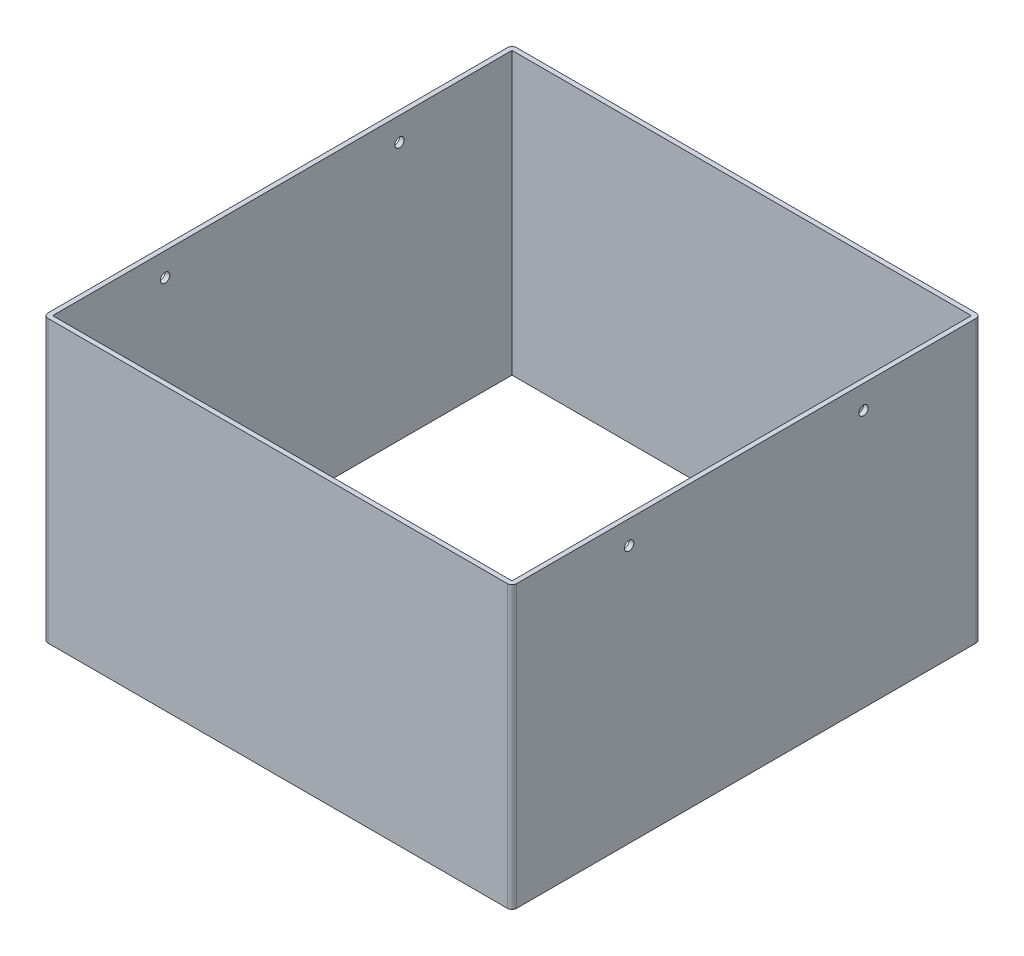
ISO-10303-21;
HEADER;
FILE_DESCRIPTION(('STEP AP214'),'2;1');
FILE_NAME('part.step','',(''),(''),'','','');
FILE_SCHEMA(('AUTOMOTIVE_DESIGN { 1 0 10303 214 1 1 1 1 }'));
ENDSEC;
DATA;
#1=APPLICATION_CONTEXT('core data for automotive mechanical design processes');
#2=APPLICATION_PROTOCOL_DEFINITION('international standard','automotive_design',2000,#1);
#3=PRODUCT_CONTEXT('',#1,'mechanical');
#4=PRODUCT('Part','Part','',(#3));
#5=PRODUCT_RELATED_PRODUCT_CATEGORY('part','',(#4));
#6=PRODUCT_DEFINITION_FORMATION('','',#4);
#7=PRODUCT_DEFINITION_CONTEXT('part definition',#1,'design');
#8=PRODUCT_DEFINITION('design','',#6,#7);
#9=PRODUCT_DEFINITION_SHAPE('','',#8);
#10=(LENGTH_UNIT() NAMED_UNIT(*) SI_UNIT(.MILLI.,.METRE.));
#11=(NAMED_UNIT(*) PLANE_ANGLE_UNIT() SI_UNIT($,.RADIAN.));
#12=(NAMED_UNIT(*) SI_UNIT($,.STERADIAN.) SOLID_ANGLE_UNIT());
#13=UNCERTAINTY_MEASURE_WITH_UNIT(LENGTH_MEASURE(1.E-05),#10,'distance_accuracy_value','');
#14=(GEOMETRIC_REPRESENTATION_CONTEXT(3) GLOBAL_UNCERTAINTY_ASSIGNED_CONTEXT((#13)) GLOBAL_UNIT_ASSIGNED_CONTEXT((#10,
#11,#12)) REPRESENTATION_CONTEXT('',''));
#15=CARTESIAN_POINT('',(0.,0.,0.));
#16=DIRECTION('',(0.,0.,1.));
#17=DIRECTION('',(1.,0.,0.));
#18=AXIS2_PLACEMENT_3D('',#15,#16,#17);
#19=CARTESIAN_POINT('',(50.,60.,-50.));
#20=DIRECTION('',(-1.,0.,0.));
#21=DIRECTION('',(0.,0.,1.));
#22=AXIS2_PLACEMENT_3D('',#19,#20,#21);
#23=PLANE('',#22);
#24=CARTESIAN_POINT('',(50.,55.,-25.));
#25=DIRECTION('',(-1.,0.,0.));
#26=DIRECTION('',(0.,0.,1.));
#27=AXIS2_PLACEMENT_3D('',#24,#25,#26);
#28=CIRCLE('',#27,1.);
#29=CARTESIAN_POINT('',(50.,55.,-24.));
#30=VERTEX_POINT('',#29);
#31=EDGE_CURVE('E235',#30,#30,#28,.T.);
#32=ORIENTED_EDGE('',*,*,#31,.T.);
#33=EDGE_LOOP('',(#32));
#34=FACE_BOUND('',#33,.T.);
#35=DIRECTION('',(0.,0.,-1.));
#36=VECTOR('',#35,1.);
#37=CARTESIAN_POINT('',(50.,60.,-50.));
#38=LINE('',#37,#36);
#39=CARTESIAN_POINT('',(50.,60.,49.));
#40=VERTEX_POINT('',#39);
#41=CARTESIAN_POINT('',(50.,60.,-49.));
#42=VERTEX_POINT('',#41);
#43=EDGE_CURVE('E182',#40,#42,#38,.T.);
#44=ORIENTED_EDGE('',*,*,#43,.F.);
#45=DIRECTION('',(0.,-1.,0.));
#46=VECTOR('',#45,1.);
#47=CARTESIAN_POINT('',(50.,60.,49.));
#48=LINE('',#47,#46);
#49=CARTESIAN_POINT('',(50.,0.,49.));
#50=VERTEX_POINT('',#49);
#51=EDGE_CURVE('E275',#40,#50,#48,.T.);
#52=ORIENTED_EDGE('',*,*,#51,.T.);
#53=DIRECTION('',(0.,0.,-1.));
#54=VECTOR('',#53,1.);
#55=CARTESIAN_POINT('',(50.,0.,-50.));
#56=LINE('',#55,#54);
#57=CARTESIAN_POINT('',(50.,0.,-49.));
#58=VERTEX_POINT('',#57);
#59=EDGE_CURVE('E177',#50,#58,#56,.T.);
#60=ORIENTED_EDGE('',*,*,#59,.T.);
#61=DIRECTION('',(0.,-1.,0.));
#62=VECTOR('',#61,1.);
#63=CARTESIAN_POINT('',(50.,60.,-49.));
#64=LINE('',#63,#62);
#65=EDGE_CURVE('E272',#58,#42,#64,.F.);
#66=ORIENTED_EDGE('',*,*,#65,.T.);
#67=EDGE_LOOP('',(#44,#52,#60,#66));
#68=FACE_BOUND('',#67,.T.);
#69=CARTESIAN_POINT('',(50.,55.,25.));
#70=DIRECTION('',(-1.,0.,0.));
#71=DIRECTION('',(0.,0.,1.));
#72=AXIS2_PLACEMENT_3D('',#69,#70,#71);
#73=CIRCLE('',#72,1.);
#74=CARTESIAN_POINT('',(50.,55.,26.));
#75=VERTEX_POINT('',#74);
#76=EDGE_CURVE('E389',#75,#75,#73,.F.);
#77=ORIENTED_EDGE('',*,*,#76,.F.);
#78=EDGE_LOOP('',(#77));
#79=FACE_BOUND('',#78,.T.);
#80=ADVANCED_FACE('F48',(#34,#68,#79),#23,.F.);
#81=CARTESIAN_POINT('',(-50.,60.,-50.));
#82=DIRECTION('',(1.,0.,0.));
#83=DIRECTION('',(0.,0.,-1.));
#84=AXIS2_PLACEMENT_3D('',#81,#82,#83);
#85=PLANE('',#84);
#86=CARTESIAN_POINT('',(-50.,55.,-25.));
#87=DIRECTION('',(-1.,0.,0.));
#88=DIRECTION('',(0.,0.,1.));
#89=AXIS2_PLACEMENT_3D('',#86,#87,#88);
#90=CIRCLE('',#89,1.);
#91=CARTESIAN_POINT('',(-50.,55.,-24.));
#92=VERTEX_POINT('',#91);
#93=EDGE_CURVE('E376',#92,#92,#90,.T.);
#94=ORIENTED_EDGE('',*,*,#93,.F.);
#95=EDGE_LOOP('',(#94));
#96=FACE_BOUND('',#95,.T.);
#97=DIRECTION('',(0.,0.,1.));
#98=VECTOR('',#97,1.);
#99=CARTESIAN_POINT('',(-50.,0.,-50.));
#100=LINE('',#99,#98);
#101=CARTESIAN_POINT('',(-50.,0.,-49.));
#102=VERTEX_POINT('',#101);
#103=CARTESIAN_POINT('',(-50.,0.,49.));
#104=VERTEX_POINT('',#103);
#105=EDGE_CURVE('E204',#102,#104,#100,.T.);
#106=ORIENTED_EDGE('',*,*,#105,.T.);
#107=DIRECTION('',(0.,-1.,0.));
#108=VECTOR('',#107,1.);
#109=CARTESIAN_POINT('',(-50.,60.,49.));
#110=LINE('',#109,#108);
#111=CARTESIAN_POINT('',(-50.,60.,49.));
#112=VERTEX_POINT('',#111);
#113=EDGE_CURVE('E258',#104,#112,#110,.F.);
#114=ORIENTED_EDGE('',*,*,#113,.T.);
#115=DIRECTION('',(0.,0.,1.));
#116=VECTOR('',#115,1.);
#117=CARTESIAN_POINT('',(-50.,60.,-50.));
#118=LINE('',#117,#116);
#119=CARTESIAN_POINT('',(-50.,60.,-49.));
#120=VERTEX_POINT('',#119);
#121=EDGE_CURVE('E189',#120,#112,#118,.T.);
#122=ORIENTED_EDGE('',*,*,#121,.F.);
#123=DIRECTION('',(0.,-1.,0.));
#124=VECTOR('',#123,1.);
#125=CARTESIAN_POINT('',(-50.,60.,-49.));
#126=LINE('',#125,#124);
#127=EDGE_CURVE('E254',#120,#102,#126,.T.);
#128=ORIENTED_EDGE('',*,*,#127,.T.);
#129=EDGE_LOOP('',(#106,#114,#122,#128));
#130=FACE_BOUND('',#129,.T.);
#131=CARTESIAN_POINT('',(-50.,55.,25.));
#132=DIRECTION('',(-1.,0.,0.));
#133=DIRECTION('',(0.,0.,1.));
#134=AXIS2_PLACEMENT_3D('',#131,#132,#133);
#135=CIRCLE('',#134,1.);
#136=CARTESIAN_POINT('',(-50.,55.,26.));
#137=VERTEX_POINT('',#136);
#138=EDGE_CURVE('E229',#137,#137,#135,.F.);
#139=ORIENTED_EDGE('',*,*,#138,.T.);
#140=EDGE_LOOP('',(#139));
#141=FACE_BOUND('',#140,.T.);
#142=ADVANCED_FACE('F301',(#96,#130,#141),#85,.F.);
#143=CARTESIAN_POINT('',(49.,-165.,-49.));
#144=DIRECTION('',(1.,0.,0.));
#145=DIRECTION('',(0.,0.,-1.));
#146=AXIS2_PLACEMENT_3D('',#143,#144,#145);
#147=PLANE('',#146);
#148=CARTESIAN_POINT('',(49.,55.,-25.));
#149=DIRECTION('',(1.,0.,0.));
#150=DIRECTION('',(0.,0.,-1.));
#151=AXIS2_PLACEMENT_3D('',#148,#149,#150);
#152=CIRCLE('',#151,1.);
#153=CARTESIAN_POINT('',(49.,55.,-26.));
#154=VERTEX_POINT('',#153);
#155=EDGE_CURVE('E228',#154,#154,#152,.T.);
#156=ORIENTED_EDGE('',*,*,#155,.T.);
#157=EDGE_LOOP('',(#156));
#158=FACE_BOUND('',#157,.T.);
#159=DIRECTION('',(0.,1.,0.));
#160=VECTOR('',#159,1.);
#161=CARTESIAN_POINT('',(49.,-165.,49.));
#162=LINE('',#161,#160);
#163=CARTESIAN_POINT('',(49.,0.,49.));
#164=VERTEX_POINT('',#163);
#165=CARTESIAN_POINT('',(49.,60.,49.));
#166=VERTEX_POINT('',#165);
#167=EDGE_CURVE('E174',#164,#166,#162,.T.);
#168=ORIENTED_EDGE('',*,*,#167,.T.);
#169=DIRECTION('',(0.,0.,-1.));
#170=VECTOR('',#169,1.);
#171=CARTESIAN_POINT('',(49.,60.,-49.));
#172=LINE('',#171,#170);
#173=CARTESIAN_POINT('',(49.,60.,-49.));
#174=VERTEX_POINT('',#173);
#175=EDGE_CURVE('E163',#166,#174,#172,.T.);
#176=ORIENTED_EDGE('',*,*,#175,.T.);
#177=DIRECTION('',(0.,1.,0.));
#178=VECTOR('',#177,1.);
#179=CARTESIAN_POINT('',(49.,-165.,-49.));
#180=LINE('',#179,#178);
#181=CARTESIAN_POINT('',(49.,0.,-49.));
#182=VERTEX_POINT('',#181);
#183=EDGE_CURVE('E153',#182,#174,#180,.T.);
#184=ORIENTED_EDGE('',*,*,#183,.F.);
#185=DIRECTION('',(0.,0.,-1.));
#186=VECTOR('',#185,1.);
#187=CARTESIAN_POINT('',(49.,0.,0.));
#188=LINE('',#187,#186);
#189=EDGE_CURVE('E219',#164,#182,#188,.T.);
#190=ORIENTED_EDGE('',*,*,#189,.F.);
#191=EDGE_LOOP('',(#168,#176,#184,#190));
#192=FACE_BOUND('',#191,.T.);
#193=CARTESIAN_POINT('',(49.,55.,25.));
#194=DIRECTION('',(1.,0.,0.));
#195=DIRECTION('',(0.,0.,-1.));
#196=AXIS2_PLACEMENT_3D('',#193,#194,#195);
#197=CIRCLE('',#196,1.);
#198=CARTESIAN_POINT('',(49.,55.,24.));
#199=VERTEX_POINT('',#198);
#200=EDGE_CURVE('E234',#199,#199,#197,.F.);
#201=ORIENTED_EDGE('',*,*,#200,.F.);
#202=EDGE_LOOP('',(#201));
#203=FACE_BOUND('',#202,.T.);
#204=ADVANCED_FACE('F328',(#158,#192,#203),#147,.F.);
#205=CARTESIAN_POINT('',(-49.,-165.,-49.));
#206=DIRECTION('',(-1.,0.,0.));
#207=DIRECTION('',(0.,0.,1.));
#208=AXIS2_PLACEMENT_3D('',#205,#206,#207);
#209=PLANE('',#208);
#210=CARTESIAN_POINT('',(-49.,55.,-25.));
#211=DIRECTION('',(-1.,0.,0.));
#212=DIRECTION('',(0.,0.,1.));
#213=AXIS2_PLACEMENT_3D('',#210,#211,#212);
#214=CIRCLE('',#213,1.);
#215=CARTESIAN_POINT('',(-49.,55.,-24.));
#216=VERTEX_POINT('',#215);
#217=EDGE_CURVE('E224',#216,#216,#214,.T.);
#218=ORIENTED_EDGE('',*,*,#217,.T.);
#219=EDGE_LOOP('',(#218));
#220=FACE_BOUND('',#219,.T.);
#221=DIRECTION('',(0.,1.,0.));
#222=VECTOR('',#221,1.);
#223=CARTESIAN_POINT('',(-49.,-165.,-49.));
#224=LINE('',#223,#222);
#225=CARTESIAN_POINT('',(-49.,0.,-49.));
#226=VERTEX_POINT('',#225);
#227=CARTESIAN_POINT('',(-49.,60.,-49.));
#228=VERTEX_POINT('',#227);
#229=EDGE_CURVE('E139',#226,#228,#224,.T.);
#230=ORIENTED_EDGE('',*,*,#229,.T.);
#231=DIRECTION('',(0.,0.,1.));
#232=VECTOR('',#231,1.);
#233=CARTESIAN_POINT('',(-49.,60.,-49.));
#234=LINE('',#233,#232);
#235=CARTESIAN_POINT('',(-49.,60.,49.));
#236=VERTEX_POINT('',#235);
#237=EDGE_CURVE('E145',#228,#236,#234,.T.);
#238=ORIENTED_EDGE('',*,*,#237,.T.);
#239=DIRECTION('',(0.,1.,0.));
#240=VECTOR('',#239,1.);
#241=CARTESIAN_POINT('',(-49.,-165.,49.));
#242=LINE('',#241,#240);
#243=CARTESIAN_POINT('',(-49.,0.,49.));
#244=VERTEX_POINT('',#243);
#245=EDGE_CURVE('E152',#244,#236,#242,.T.);
#246=ORIENTED_EDGE('',*,*,#245,.F.);
#247=DIRECTION('',(0.,0.,1.));
#248=VECTOR('',#247,1.);
#249=CARTESIAN_POINT('',(-49.,0.,0.));
#250=LINE('',#249,#248);
#251=EDGE_CURVE('E148',#226,#244,#250,.T.);
#252=ORIENTED_EDGE('',*,*,#251,.F.);
#253=EDGE_LOOP('',(#230,#238,#246,#252));
#254=FACE_BOUND('',#253,.T.);
#255=CARTESIAN_POINT('',(-49.,55.,25.));
#256=DIRECTION('',(-1.,0.,0.));
#257=DIRECTION('',(0.,0.,1.));
#258=AXIS2_PLACEMENT_3D('',#255,#256,#257);
#259=CIRCLE('',#258,1.);
#260=CARTESIAN_POINT('',(-49.,55.,26.));
#261=VERTEX_POINT('',#260);
#262=EDGE_CURVE('E230',#261,#261,#259,.F.);
#263=ORIENTED_EDGE('',*,*,#262,.F.);
#264=EDGE_LOOP('',(#263));
#265=FACE_BOUND('',#264,.T.);
#266=ADVANCED_FACE('F141',(#220,#254,#265),#209,.F.);
#267=CARTESIAN_POINT('',(-50.,60.,-50.));
#268=DIRECTION('',(0.,0.,1.));
#269=DIRECTION('',(1.,0.,0.));
#270=AXIS2_PLACEMENT_3D('',#267,#268,#269);
#271=PLANE('',#270);
#272=DIRECTION('',(-1.,0.,0.));
#273=VECTOR('',#272,1.);
#274=CARTESIAN_POINT('',(-50.,60.,-50.));
#275=LINE('',#274,#273);
#276=CARTESIAN_POINT('',(49.,60.,-50.));
#277=VERTEX_POINT('',#276);
#278=CARTESIAN_POINT('',(-49.,60.,-50.));
#279=VERTEX_POINT('',#278);
#280=EDGE_CURVE('E185',#277,#279,#275,.T.);
#281=ORIENTED_EDGE('',*,*,#280,.F.);
#282=DIRECTION('',(0.,-1.,0.));
#283=VECTOR('',#282,1.);
#284=CARTESIAN_POINT('',(49.,60.,-50.));
#285=LINE('',#284,#283);
#286=CARTESIAN_POINT('',(49.,0.,-50.));
#287=VERTEX_POINT('',#286);
#288=EDGE_CURVE('E12',#277,#287,#285,.T.);
#289=ORIENTED_EDGE('',*,*,#288,.T.);
#290=DIRECTION('',(-1.,0.,0.));
#291=VECTOR('',#290,1.);
#292=CARTESIAN_POINT('',(-50.,0.,-50.));
#293=LINE('',#292,#291);
#294=CARTESIAN_POINT('',(-49.,0.,-50.));
#295=VERTEX_POINT('',#294);
#296=EDGE_CURVE('E201',#287,#295,#293,.T.);
#297=ORIENTED_EDGE('',*,*,#296,.T.);
#298=DIRECTION('',(0.,-1.,0.));
#299=VECTOR('',#298,1.);
#300=CARTESIAN_POINT('',(-49.,60.,-50.));
#301=LINE('',#300,#299);
#302=EDGE_CURVE('E57',#295,#279,#301,.F.);
#303=ORIENTED_EDGE('',*,*,#302,.T.);
#304=EDGE_LOOP('',(#281,#289,#297,#303));
#305=FACE_BOUND('',#304,.T.);
#306=ADVANCED_FACE('F294',(#305),#271,.F.);
#307=CARTESIAN_POINT('',(-50.,60.,50.));
#308=DIRECTION('',(0.,0.,-1.));
#309=DIRECTION('',(-1.,0.,0.));
#310=AXIS2_PLACEMENT_3D('',#307,#308,#309);
#311=PLANE('',#310);
#312=DIRECTION('',(1.,0.,0.));
#313=VECTOR('',#312,1.);
#314=CARTESIAN_POINT('',(-50.,60.,50.));
#315=LINE('',#314,#313);
#316=CARTESIAN_POINT('',(-49.,60.,50.));
#317=VERTEX_POINT('',#316);
#318=CARTESIAN_POINT('',(49.,60.,50.));
#319=VERTEX_POINT('',#318);
#320=EDGE_CURVE('E193',#317,#319,#315,.T.);
#321=ORIENTED_EDGE('',*,*,#320,.F.);
#322=DIRECTION('',(0.,-1.,0.));
#323=VECTOR('',#322,1.);
#324=CARTESIAN_POINT('',(-49.,60.,50.));
#325=LINE('',#324,#323);
#326=CARTESIAN_POINT('',(-49.,0.,50.));
#327=VERTEX_POINT('',#326);
#328=EDGE_CURVE('E238',#317,#327,#325,.T.);
#329=ORIENTED_EDGE('',*,*,#328,.T.);
#330=DIRECTION('',(1.,0.,0.));
#331=VECTOR('',#330,1.);
#332=CARTESIAN_POINT('',(-50.,0.,50.));
#333=LINE('',#332,#331);
#334=CARTESIAN_POINT('',(49.,0.,50.));
#335=VERTEX_POINT('',#334);
#336=EDGE_CURVE('E186',#327,#335,#333,.T.);
#337=ORIENTED_EDGE('',*,*,#336,.T.);
#338=DIRECTION('',(0.,-1.,0.));
#339=VECTOR('',#338,1.);
#340=CARTESIAN_POINT('',(49.,60.,50.));
#341=LINE('',#340,#339);
#342=EDGE_CURVE('E223',#335,#319,#341,.F.);
#343=ORIENTED_EDGE('',*,*,#342,.T.);
#344=EDGE_LOOP('',(#321,#329,#337,#343));
#345=FACE_BOUND('',#344,.T.);
#346=ADVANCED_FACE('F310',(#345),#311,.F.);
#347=CARTESIAN_POINT('',(0.,60.,0.));
#348=DIRECTION('',(0.,1.,0.));
#349=DIRECTION('',(0.,0.,1.));
#350=AXIS2_PLACEMENT_3D('',#347,#348,#349);
#351=PLANE('',#350);
#352=ORIENTED_EDGE('',*,*,#175,.F.);
#353=DIRECTION('',(1.,0.,0.));
#354=VECTOR('',#353,1.);
#355=CARTESIAN_POINT('',(-49.,60.,49.));
#356=LINE('',#355,#354);
#357=EDGE_CURVE('E167',#236,#166,#356,.T.);
#358=ORIENTED_EDGE('',*,*,#357,.F.);
#359=ORIENTED_EDGE('',*,*,#237,.F.);
#360=DIRECTION('',(-1.,0.,0.));
#361=VECTOR('',#360,1.);
#362=CARTESIAN_POINT('',(-49.,60.,-49.));
#363=LINE('',#362,#361);
#364=EDGE_CURVE('E157',#174,#228,#363,.T.);
#365=ORIENTED_EDGE('',*,*,#364,.F.);
#366=EDGE_LOOP('',(#352,#358,#359,#365));
#367=FACE_BOUND('',#366,.T.);
#368=ORIENTED_EDGE('',*,*,#121,.T.);
#369=CARTESIAN_POINT('',(-49.,60.,49.));
#370=DIRECTION('',(0.,1.,0.));
#371=DIRECTION('',(0.,0.,1.));
#372=AXIS2_PLACEMENT_3D('',#369,#370,#371);
#373=CIRCLE('',#372,1.);
#374=EDGE_CURVE('E269',#112,#317,#373,.T.);
#375=ORIENTED_EDGE('',*,*,#374,.T.);
#376=ORIENTED_EDGE('',*,*,#320,.T.);
#377=CARTESIAN_POINT('',(49.,60.,49.));
#378=DIRECTION('',(0.,1.,0.));
#379=DIRECTION('',(0.,0.,1.));
#380=AXIS2_PLACEMENT_3D('',#377,#378,#379);
#381=CIRCLE('',#380,1.);
#382=EDGE_CURVE('E266',#319,#40,#381,.T.);
#383=ORIENTED_EDGE('',*,*,#382,.T.);
#384=ORIENTED_EDGE('',*,*,#43,.T.);
#385=CARTESIAN_POINT('',(49.,60.,-49.));
#386=DIRECTION('',(0.,1.,0.));
#387=DIRECTION('',(0.,0.,1.));
#388=AXIS2_PLACEMENT_3D('',#385,#386,#387);
#389=CIRCLE('',#388,1.);
#390=EDGE_CURVE('E70',#42,#277,#389,.T.);
#391=ORIENTED_EDGE('',*,*,#390,.T.);
#392=ORIENTED_EDGE('',*,*,#280,.T.);
#393=CARTESIAN_POINT('',(-49.,60.,-49.));
#394=DIRECTION('',(0.,1.,0.));
#395=DIRECTION('',(0.,0.,1.));
#396=AXIS2_PLACEMENT_3D('',#393,#394,#395);
#397=CIRCLE('',#396,1.);
#398=EDGE_CURVE('E261',#279,#120,#397,.T.);
#399=ORIENTED_EDGE('',*,*,#398,.T.);
#400=EDGE_LOOP('',(#368,#375,#376,#383,#384,#391,#392,#399));
#401=FACE_BOUND('',#400,.T.);
#402=ADVANCED_FACE('F165',(#367,#401),#351,.T.);
#403=CARTESIAN_POINT('',(0.,0.,0.));
#404=DIRECTION('',(0.,1.,0.));
#405=DIRECTION('',(0.,0.,1.));
#406=AXIS2_PLACEMENT_3D('',#403,#404,#405);
#407=PLANE('',#406);
#408=DIRECTION('',(1.,0.,0.));
#409=VECTOR('',#408,1.);
#410=CARTESIAN_POINT('',(0.,0.,49.));
#411=LINE('',#410,#409);
#412=EDGE_CURVE('E215',#244,#164,#411,.T.);
#413=ORIENTED_EDGE('',*,*,#412,.T.);
#414=ORIENTED_EDGE('',*,*,#189,.T.);
#415=DIRECTION('',(-1.,0.,0.));
#416=VECTOR('',#415,1.);
#417=CARTESIAN_POINT('',(0.,0.,-49.));
#418=LINE('',#417,#416);
#419=EDGE_CURVE('E197',#182,#226,#418,.T.);
#420=ORIENTED_EDGE('',*,*,#419,.T.);
#421=ORIENTED_EDGE('',*,*,#251,.T.);
#422=EDGE_LOOP('',(#413,#414,#420,#421));
#423=FACE_BOUND('',#422,.T.);
#424=ORIENTED_EDGE('',*,*,#336,.F.);
#425=CARTESIAN_POINT('',(-49.,0.,49.));
#426=DIRECTION('',(0.,1.,0.));
#427=DIRECTION('',(0.,0.,1.));
#428=AXIS2_PLACEMENT_3D('',#425,#426,#427);
#429=CIRCLE('',#428,1.);
#430=EDGE_CURVE('E251',#327,#104,#429,.F.);
#431=ORIENTED_EDGE('',*,*,#430,.T.);
#432=ORIENTED_EDGE('',*,*,#105,.F.);
#433=CARTESIAN_POINT('',(-49.,0.,-49.));
#434=DIRECTION('',(0.,1.,0.));
#435=DIRECTION('',(0.,0.,1.));
#436=AXIS2_PLACEMENT_3D('',#433,#434,#435);
#437=CIRCLE('',#436,1.);
#438=EDGE_CURVE('E242',#102,#295,#437,.F.);
#439=ORIENTED_EDGE('',*,*,#438,.T.);
#440=ORIENTED_EDGE('',*,*,#296,.F.);
#441=CARTESIAN_POINT('',(49.,0.,-49.));
#442=DIRECTION('',(0.,1.,0.));
#443=DIRECTION('',(0.,0.,1.));
#444=AXIS2_PLACEMENT_3D('',#441,#442,#443);
#445=CIRCLE('',#444,1.);
#446=EDGE_CURVE('E245',#287,#58,#445,.F.);
#447=ORIENTED_EDGE('',*,*,#446,.T.);
#448=ORIENTED_EDGE('',*,*,#59,.F.);
#449=CARTESIAN_POINT('',(49.,0.,49.));
#450=DIRECTION('',(0.,1.,0.));
#451=DIRECTION('',(0.,0.,1.));
#452=AXIS2_PLACEMENT_3D('',#449,#450,#451);
#453=CIRCLE('',#452,1.);
#454=EDGE_CURVE('E248',#50,#335,#453,.F.);
#455=ORIENTED_EDGE('',*,*,#454,.T.);
#456=EDGE_LOOP('',(#424,#431,#432,#439,#440,#447,#448,#455));
#457=FACE_BOUND('',#456,.T.);
#458=ADVANCED_FACE('F289',(#423,#457),#407,.F.);
#459=CARTESIAN_POINT('',(-49.,-165.,49.));
#460=DIRECTION('',(0.,0.,1.));
#461=DIRECTION('',(1.,0.,0.));
#462=AXIS2_PLACEMENT_3D('',#459,#460,#461);
#463=PLANE('',#462);
#464=ORIENTED_EDGE('',*,*,#245,.T.);
#465=ORIENTED_EDGE('',*,*,#357,.T.);
#466=ORIENTED_EDGE('',*,*,#167,.F.);
#467=ORIENTED_EDGE('',*,*,#412,.F.);
#468=EDGE_LOOP('',(#464,#465,#466,#467));
#469=FACE_BOUND('',#468,.T.);
#470=ADVANCED_FACE('F339',(#469),#463,.F.);
#471=CARTESIAN_POINT('',(-49.,-165.,-49.));
#472=DIRECTION('',(0.,0.,-1.));
#473=DIRECTION('',(-1.,0.,0.));
#474=AXIS2_PLACEMENT_3D('',#471,#472,#473);
#475=PLANE('',#474);
#476=ORIENTED_EDGE('',*,*,#183,.T.);
#477=ORIENTED_EDGE('',*,*,#364,.T.);
#478=ORIENTED_EDGE('',*,*,#229,.F.);
#479=ORIENTED_EDGE('',*,*,#419,.F.);
#480=EDGE_LOOP('',(#476,#477,#478,#479));
#481=FACE_BOUND('',#480,.T.);
#482=ADVANCED_FACE('F158',(#481),#475,.F.);
#483=CARTESIAN_POINT('',(68.,55.,-25.));
#484=DIRECTION('',(-1.,0.,0.));
#485=DIRECTION('',(0.,0.,1.));
#486=AXIS2_PLACEMENT_3D('',#483,#484,#485);
#487=CYLINDRICAL_SURFACE('',#486,1.);
#488=ORIENTED_EDGE('',*,*,#93,.T.);
#489=EDGE_LOOP('',(#488));
#490=FACE_BOUND('',#489,.T.);
#491=ORIENTED_EDGE('',*,*,#217,.F.);
#492=EDGE_LOOP('',(#491));
#493=FACE_BOUND('',#492,.T.);
#494=ADVANCED_FACE('F348',(#490,#493),#487,.F.);
#495=CARTESIAN_POINT('',(68.,55.,25.));
#496=DIRECTION('',(-1.,0.,0.));
#497=DIRECTION('',(0.,0.,1.));
#498=AXIS2_PLACEMENT_3D('',#495,#496,#497);
#499=CYLINDRICAL_SURFACE('',#498,1.);
#500=ORIENTED_EDGE('',*,*,#138,.F.);
#501=EDGE_LOOP('',(#500));
#502=FACE_BOUND('',#501,.T.);
#503=ORIENTED_EDGE('',*,*,#262,.T.);
#504=EDGE_LOOP('',(#503));
#505=FACE_BOUND('',#504,.T.);
#506=ADVANCED_FACE('F358',(#502,#505),#499,.F.);
#507=ORIENTED_EDGE('',*,*,#155,.F.);
#508=EDGE_LOOP('',(#507));
#509=FACE_BOUND('',#508,.T.);
#510=ORIENTED_EDGE('',*,*,#31,.F.);
#511=EDGE_LOOP('',(#510));
#512=FACE_BOUND('',#511,.T.);
#513=ADVANCED_FACE('F355',(#509,#512),#487,.F.);
#514=ORIENTED_EDGE('',*,*,#200,.T.);
#515=EDGE_LOOP('',(#514));
#516=FACE_BOUND('',#515,.T.);
#517=ORIENTED_EDGE('',*,*,#76,.T.);
#518=EDGE_LOOP('',(#517));
#519=FACE_BOUND('',#518,.T.);
#520=ADVANCED_FACE('F319',(#516,#519),#499,.F.);
#521=CARTESIAN_POINT('',(-49.,60.,49.));
#522=DIRECTION('',(0.,-1.,0.));
#523=DIRECTION('',(0.,0.,-1.));
#524=AXIS2_PLACEMENT_3D('',#521,#522,#523);
#525=CYLINDRICAL_SURFACE('',#524,1.);
#526=ORIENTED_EDGE('',*,*,#374,.F.);
#527=ORIENTED_EDGE('',*,*,#113,.F.);
#528=ORIENTED_EDGE('',*,*,#430,.F.);
#529=ORIENTED_EDGE('',*,*,#328,.F.);
#530=EDGE_LOOP('',(#526,#527,#528,#529));
#531=FACE_BOUND('',#530,.T.);
#532=ADVANCED_FACE('F307',(#531),#525,.T.);
#533=CARTESIAN_POINT('',(49.,60.,49.));
#534=DIRECTION('',(0.,-1.,0.));
#535=DIRECTION('',(0.,0.,-1.));
#536=AXIS2_PLACEMENT_3D('',#533,#534,#535);
#537=CYLINDRICAL_SURFACE('',#536,1.);
#538=ORIENTED_EDGE('',*,*,#382,.F.);
#539=ORIENTED_EDGE('',*,*,#342,.F.);
#540=ORIENTED_EDGE('',*,*,#454,.F.);
#541=ORIENTED_EDGE('',*,*,#51,.F.);
#542=EDGE_LOOP('',(#538,#539,#540,#541));
#543=FACE_BOUND('',#542,.T.);
#544=ADVANCED_FACE('F312',(#543),#537,.T.);
#545=CARTESIAN_POINT('',(49.,60.,-49.));
#546=DIRECTION('',(0.,-1.,0.));
#547=DIRECTION('',(0.,0.,-1.));
#548=AXIS2_PLACEMENT_3D('',#545,#546,#547);
#549=CYLINDRICAL_SURFACE('',#548,1.);
#550=ORIENTED_EDGE('',*,*,#390,.F.);
#551=ORIENTED_EDGE('',*,*,#65,.F.);
#552=ORIENTED_EDGE('',*,*,#446,.F.);
#553=ORIENTED_EDGE('',*,*,#288,.F.);
#554=EDGE_LOOP('',(#550,#551,#552,#553));
#555=FACE_BOUND('',#554,.T.);
#556=ADVANCED_FACE('F293',(#555),#549,.T.);
#557=CARTESIAN_POINT('',(-49.,60.,-49.));
#558=DIRECTION('',(0.,-1.,0.));
#559=DIRECTION('',(0.,0.,-1.));
#560=AXIS2_PLACEMENT_3D('',#557,#558,#559);
#561=CYLINDRICAL_SURFACE('',#560,1.);
#562=ORIENTED_EDGE('',*,*,#398,.F.);
#563=ORIENTED_EDGE('',*,*,#302,.F.);
#564=ORIENTED_EDGE('',*,*,#438,.F.);
#565=ORIENTED_EDGE('',*,*,#127,.F.);
#566=EDGE_LOOP('',(#562,#563,#564,#565));
#567=FACE_BOUND('',#566,.T.);
#568=ADVANCED_FACE('F50',(#567),#561,.T.);
#569=CLOSED_SHELL('',(#80,#142,#204,#266,#306,#346,#402,#458,#470,#482,#494,#506,#513,#520,#532,
#544,#556,#568));
#570=MANIFOLD_SOLID_BREP('B2',#569);
#571=ADVANCED_BREP_SHAPE_REPRESENTATION('',(#18,#570),#14);
#572=SHAPE_DEFINITION_REPRESENTATION(#9,#571);
ENDSEC;
END-ISO-10303-21;
